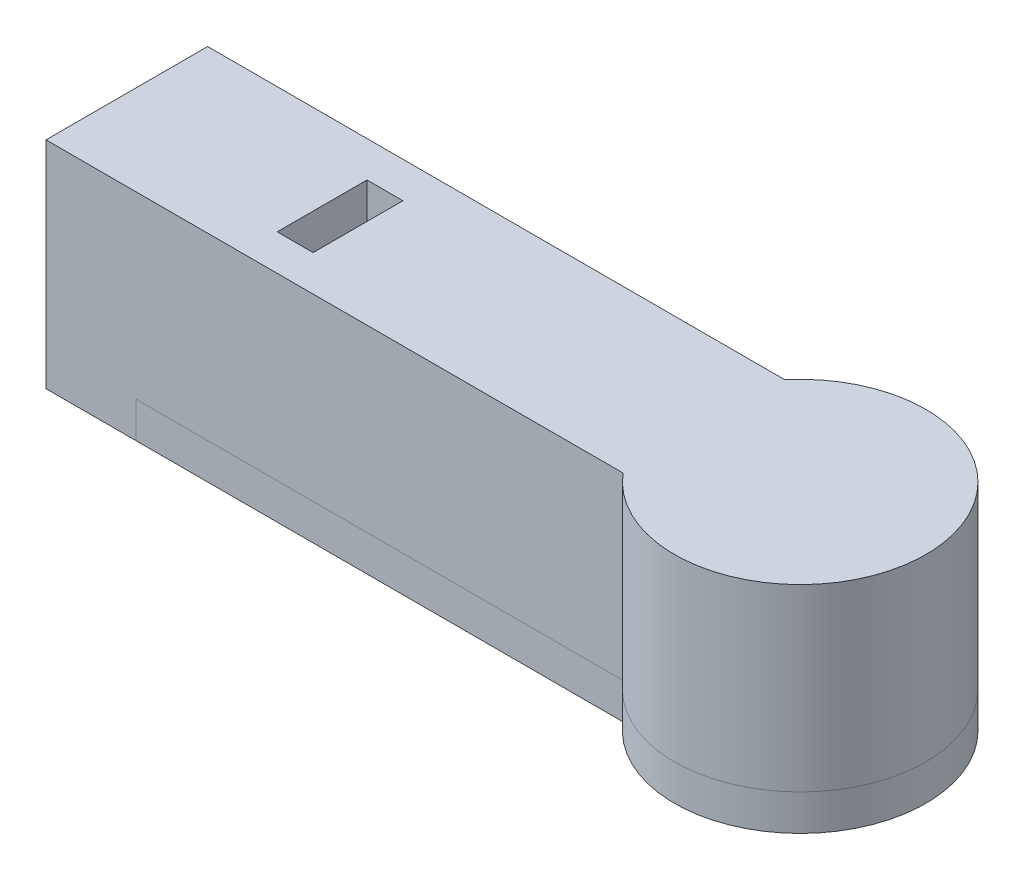
ISO-10303-21;
HEADER;
FILE_DESCRIPTION(('STEP AP214'),'2;1');
FILE_NAME('part.step','',(''),(''),'','','');
FILE_SCHEMA(('AUTOMOTIVE_DESIGN { 1 0 10303 214 1 1 1 1 }'));
ENDSEC;
DATA;
#1=APPLICATION_CONTEXT('core data for automotive mechanical design processes');
#2=APPLICATION_PROTOCOL_DEFINITION('international standard','automotive_design',2000,#1);
#3=PRODUCT_CONTEXT('',#1,'mechanical');
#4=PRODUCT('Part','Part','',(#3));
#5=PRODUCT_RELATED_PRODUCT_CATEGORY('part','',(#4));
#6=PRODUCT_DEFINITION_FORMATION('','',#4);
#7=PRODUCT_DEFINITION_CONTEXT('part definition',#1,'design');
#8=PRODUCT_DEFINITION('design','',#6,#7);
#9=PRODUCT_DEFINITION_SHAPE('','',#8);
#10=(LENGTH_UNIT() NAMED_UNIT(*) SI_UNIT(.MILLI.,.METRE.));
#11=(NAMED_UNIT(*) PLANE_ANGLE_UNIT() SI_UNIT($,.RADIAN.));
#12=(NAMED_UNIT(*) SI_UNIT($,.STERADIAN.) SOLID_ANGLE_UNIT());
#13=UNCERTAINTY_MEASURE_WITH_UNIT(LENGTH_MEASURE(1.E-05),#10,'distance_accuracy_value','');
#14=(GEOMETRIC_REPRESENTATION_CONTEXT(3) GLOBAL_UNCERTAINTY_ASSIGNED_CONTEXT((#13)) GLOBAL_UNIT_ASSIGNED_CONTEXT((#10,
#11,#12)) REPRESENTATION_CONTEXT('',''));
#15=CARTESIAN_POINT('',(0.,0.,0.));
#16=DIRECTION('',(0.,0.,1.));
#17=DIRECTION('',(1.,0.,0.));
#18=AXIS2_PLACEMENT_3D('',#15,#16,#17);
#19=CARTESIAN_POINT('',(32.4914636122196,-12.,1.09900668424429));
#20=DIRECTION('',(0.,-1.,0.));
#21=DIRECTION('',(0.,0.,-1.));
#22=AXIS2_PLACEMENT_3D('',#19,#20,#21);
#23=PLANE('',#22);
#24=DIRECTION('',(0.,0.,-1.));
#25=VECTOR('',#24,1.);
#26=CARTESIAN_POINT('',(0.,-12.,5.59900668424429));
#27=LINE('',#26,#25);
#28=CARTESIAN_POINT('',(0.,-12.,5.59900668424429));
#29=VERTEX_POINT('',#28);
#30=CARTESIAN_POINT('',(0.,-12.,-3.40099331575571));
#31=VERTEX_POINT('',#30);
#32=EDGE_CURVE('E97',#29,#31,#27,.T.);
#33=ORIENTED_EDGE('',*,*,#32,.T.);
#34=DIRECTION('',(1.,0.,0.));
#35=VECTOR('',#34,1.);
#36=CARTESIAN_POINT('',(0.,-12.,-3.40099331575571));
#37=LINE('',#36,#35);
#38=CARTESIAN_POINT('',(27.1295609648378,-12.,-3.40099331575571));
#39=VERTEX_POINT('',#38);
#40=EDGE_CURVE('E92',#31,#39,#37,.T.);
#41=ORIENTED_EDGE('',*,*,#40,.T.);
#42=CARTESIAN_POINT('',(32.4914636122196,-12.,1.09900668424429));
#43=DIRECTION('',(0.,-1.,0.));
#44=DIRECTION('',(0.,0.,-1.));
#45=AXIS2_PLACEMENT_3D('',#42,#43,#44);
#46=CIRCLE('',#45,7.);
#47=CARTESIAN_POINT('',(27.1295609648378,-12.,5.59900668424429));
#48=VERTEX_POINT('',#47);
#49=EDGE_CURVE('E95',#39,#48,#46,.T.);
#50=ORIENTED_EDGE('',*,*,#49,.T.);
#51=DIRECTION('',(-1.,0.,0.));
#52=VECTOR('',#51,1.);
#53=CARTESIAN_POINT('',(0.,-12.,5.59900668424429));
#54=LINE('',#53,#52);
#55=EDGE_CURVE('E62',#48,#29,#54,.T.);
#56=ORIENTED_EDGE('',*,*,#55,.T.);
#57=EDGE_LOOP('',(#33,#41,#50,#56));
#58=FACE_BOUND('',#57,.T.);
#59=CARTESIAN_POINT('',(32.4914636122196,-12.,1.09900668424429));
#60=DIRECTION('',(0.,-1.,0.));
#61=DIRECTION('',(0.,0.,-1.));
#62=AXIS2_PLACEMENT_3D('',#59,#60,#61);
#63=CIRCLE('',#62,3.5);
#64=CARTESIAN_POINT('',(32.4914636122196,-12.,-2.40099331575571));
#65=VERTEX_POINT('',#64);
#66=EDGE_CURVE('E112',#65,#65,#63,.T.);
#67=ORIENTED_EDGE('',*,*,#66,.F.);
#68=EDGE_LOOP('',(#67));
#69=FACE_BOUND('',#68,.T.);
#70=ADVANCED_FACE('F45',(#58,#69),#23,.T.);
#71=CARTESIAN_POINT('',(32.4914636122196,-10.,1.09900668424429));
#72=DIRECTION('',(0.,-1.,0.));
#73=DIRECTION('',(0.,0.,-1.));
#74=AXIS2_PLACEMENT_3D('',#71,#72,#73);
#75=PLANE('',#74);
#76=DIRECTION('',(0.,0.,-1.));
#77=VECTOR('',#76,1.);
#78=CARTESIAN_POINT('',(0.,-10.,5.59900668424429));
#79=LINE('',#78,#77);
#80=CARTESIAN_POINT('',(0.,-10.,5.59900668424429));
#81=VERTEX_POINT('',#80);
#82=CARTESIAN_POINT('',(0.,-10.,-3.40099331575571));
#83=VERTEX_POINT('',#82);
#84=EDGE_CURVE('E109',#81,#83,#79,.T.);
#85=ORIENTED_EDGE('',*,*,#84,.F.);
#86=DIRECTION('',(-1.,0.,0.));
#87=VECTOR('',#86,1.);
#88=CARTESIAN_POINT('',(0.,-10.,5.59900668424429));
#89=LINE('',#88,#87);
#90=CARTESIAN_POINT('',(27.1295609648378,-10.,5.59900668424429));
#91=VERTEX_POINT('',#90);
#92=EDGE_CURVE('E85',#91,#81,#89,.T.);
#93=ORIENTED_EDGE('',*,*,#92,.F.);
#94=CARTESIAN_POINT('',(32.4914636122196,-10.,1.09900668424429));
#95=DIRECTION('',(0.,-1.,0.));
#96=DIRECTION('',(0.,0.,-1.));
#97=AXIS2_PLACEMENT_3D('',#94,#95,#96);
#98=CIRCLE('',#97,7.);
#99=CARTESIAN_POINT('',(27.1295609648378,-10.,-3.40099331575571));
#100=VERTEX_POINT('',#99);
#101=EDGE_CURVE('E79',#100,#91,#98,.T.);
#102=ORIENTED_EDGE('',*,*,#101,.F.);
#103=DIRECTION('',(1.,0.,0.));
#104=VECTOR('',#103,1.);
#105=CARTESIAN_POINT('',(0.,-10.,-3.40099331575571));
#106=LINE('',#105,#104);
#107=EDGE_CURVE('E101',#83,#100,#106,.T.);
#108=ORIENTED_EDGE('',*,*,#107,.F.);
#109=EDGE_LOOP('',(#85,#93,#102,#108));
#110=FACE_BOUND('',#109,.T.);
#111=CARTESIAN_POINT('',(32.4914636122196,-10.,1.09900668424429));
#112=DIRECTION('',(0.,-1.,0.));
#113=DIRECTION('',(0.,0.,-1.));
#114=AXIS2_PLACEMENT_3D('',#111,#112,#113);
#115=CIRCLE('',#114,3.5);
#116=CARTESIAN_POINT('',(32.4914636122196,-10.,-2.40099331575571));
#117=VERTEX_POINT('',#116);
#118=EDGE_CURVE('E124',#117,#117,#115,.T.);
#119=ORIENTED_EDGE('',*,*,#118,.T.);
#120=EDGE_LOOP('',(#119));
#121=FACE_BOUND('',#120,.T.);
#122=ADVANCED_FACE('F120',(#110,#121),#75,.F.);
#123=CARTESIAN_POINT('',(0.,-12.,5.59900668424429));
#124=DIRECTION('',(1.,0.,0.));
#125=DIRECTION('',(0.,0.,-1.));
#126=AXIS2_PLACEMENT_3D('',#123,#124,#125);
#127=PLANE('',#126);
#128=ORIENTED_EDGE('',*,*,#84,.T.);
#129=DIRECTION('',(0.,1.,0.));
#130=VECTOR('',#129,1.);
#131=CARTESIAN_POINT('',(0.,-12.,-3.40099331575571));
#132=LINE('',#131,#130);
#133=EDGE_CURVE('E12',#31,#83,#132,.T.);
#134=ORIENTED_EDGE('',*,*,#133,.F.);
#135=ORIENTED_EDGE('',*,*,#32,.F.);
#136=DIRECTION('',(0.,1.,0.));
#137=VECTOR('',#136,1.);
#138=CARTESIAN_POINT('',(0.,-12.,5.59900668424429));
#139=LINE('',#138,#137);
#140=EDGE_CURVE('E105',#29,#81,#139,.T.);
#141=ORIENTED_EDGE('',*,*,#140,.T.);
#142=EDGE_LOOP('',(#128,#134,#135,#141));
#143=FACE_BOUND('',#142,.T.);
#144=ADVANCED_FACE('F47',(#143),#127,.F.);
#145=CARTESIAN_POINT('',(0.,-12.,-3.40099331575571));
#146=DIRECTION('',(0.,0.,1.));
#147=DIRECTION('',(1.,0.,0.));
#148=AXIS2_PLACEMENT_3D('',#145,#146,#147);
#149=PLANE('',#148);
#150=ORIENTED_EDGE('',*,*,#107,.T.);
#151=DIRECTION('',(0.,1.,0.));
#152=VECTOR('',#151,1.);
#153=CARTESIAN_POINT('',(27.1295609648378,-12.,-3.40099331575571));
#154=LINE('',#153,#152);
#155=EDGE_CURVE('E54',#39,#100,#154,.T.);
#156=ORIENTED_EDGE('',*,*,#155,.F.);
#157=ORIENTED_EDGE('',*,*,#40,.F.);
#158=ORIENTED_EDGE('',*,*,#133,.T.);
#159=EDGE_LOOP('',(#150,#156,#157,#158));
#160=FACE_BOUND('',#159,.T.);
#161=ADVANCED_FACE('F100',(#160),#149,.F.);
#162=CARTESIAN_POINT('',(32.4914636122196,-12.,1.09900668424429));
#163=DIRECTION('',(0.,1.,0.));
#164=DIRECTION('',(0.,0.,1.));
#165=AXIS2_PLACEMENT_3D('',#162,#163,#164);
#166=CYLINDRICAL_SURFACE('',#165,7.);
#167=ORIENTED_EDGE('',*,*,#101,.T.);
#168=DIRECTION('',(0.,1.,0.));
#169=VECTOR('',#168,1.);
#170=CARTESIAN_POINT('',(27.1295609648378,-12.,5.59900668424429));
#171=LINE('',#170,#169);
#172=EDGE_CURVE('E102',#48,#91,#171,.T.);
#173=ORIENTED_EDGE('',*,*,#172,.F.);
#174=ORIENTED_EDGE('',*,*,#49,.F.);
#175=ORIENTED_EDGE('',*,*,#155,.T.);
#176=EDGE_LOOP('',(#167,#173,#174,#175));
#177=FACE_BOUND('',#176,.T.);
#178=ADVANCED_FACE('F103',(#177),#166,.T.);
#179=CARTESIAN_POINT('',(0.,-12.,5.59900668424429));
#180=DIRECTION('',(0.,0.,-1.));
#181=DIRECTION('',(-1.,0.,0.));
#182=AXIS2_PLACEMENT_3D('',#179,#180,#181);
#183=PLANE('',#182);
#184=ORIENTED_EDGE('',*,*,#92,.T.);
#185=ORIENTED_EDGE('',*,*,#140,.F.);
#186=ORIENTED_EDGE('',*,*,#55,.F.);
#187=ORIENTED_EDGE('',*,*,#172,.T.);
#188=EDGE_LOOP('',(#184,#185,#186,#187));
#189=FACE_BOUND('',#188,.T.);
#190=ADVANCED_FACE('F117',(#189),#183,.F.);
#191=CARTESIAN_POINT('',(32.4914636122196,-12.,1.09900668424429));
#192=DIRECTION('',(0.,1.,0.));
#193=DIRECTION('',(0.,0.,1.));
#194=AXIS2_PLACEMENT_3D('',#191,#192,#193);
#195=CYLINDRICAL_SURFACE('',#194,3.5);
#196=ORIENTED_EDGE('',*,*,#66,.T.);
#197=EDGE_LOOP('',(#196));
#198=FACE_BOUND('',#197,.T.);
#199=ORIENTED_EDGE('',*,*,#118,.F.);
#200=EDGE_LOOP('',(#199));
#201=FACE_BOUND('',#200,.T.);
#202=ADVANCED_FACE('F130',(#198,#201),#195,.F.);
#203=CLOSED_SHELL('',(#70,#122,#144,#161,#178,#190,#202));
#204=MANIFOLD_SOLID_BREP('B2',#203);
#205=CARTESIAN_POINT('',(32.4914636122196,-2.,1.09900668424429));
#206=DIRECTION('',(0.,1.,0.));
#207=DIRECTION('',(0.,0.,1.));
#208=AXIS2_PLACEMENT_3D('',#205,#206,#207);
#209=PLANE('',#208);
#210=DIRECTION('',(1.,0.,0.));
#211=VECTOR('',#210,1.);
#212=CARTESIAN_POINT('',(4.,-2.,-1.40099331575571));
#213=LINE('',#212,#211);
#214=CARTESIAN_POINT('',(4.,-2.,-1.40099331575571));
#215=VERTEX_POINT('',#214);
#216=CARTESIAN_POINT('',(5.87171249538747,-2.,-1.40099331575571));
#217=VERTEX_POINT('',#216);
#218=EDGE_CURVE('E406',#215,#217,#213,.T.);
#219=ORIENTED_EDGE('',*,*,#218,.T.);
#220=DIRECTION('',(0.,0.,-1.));
#221=VECTOR('',#220,1.);
#222=CARTESIAN_POINT('',(5.87171249538747,-2.,3.59900668424429));
#223=LINE('',#222,#221);
#224=CARTESIAN_POINT('',(5.87171249538747,-2.,3.59900668424429));
#225=VERTEX_POINT('',#224);
#226=EDGE_CURVE('E213',#225,#217,#223,.T.);
#227=ORIENTED_EDGE('',*,*,#226,.F.);
#228=DIRECTION('',(-1.,0.,0.));
#229=VECTOR('',#228,1.);
#230=CARTESIAN_POINT('',(4.,-2.,3.59900668424429));
#231=LINE('',#230,#229);
#232=CARTESIAN_POINT('',(4.,-2.,3.59900668424429));
#233=VERTEX_POINT('',#232);
#234=EDGE_CURVE('E412',#225,#233,#231,.T.);
#235=ORIENTED_EDGE('',*,*,#234,.T.);
#236=DIRECTION('',(0.,0.,-1.));
#237=VECTOR('',#236,1.);
#238=CARTESIAN_POINT('',(4.,-2.,3.59900668424429));
#239=LINE('',#238,#237);
#240=CARTESIAN_POINT('',(4.,-2.,1.09900668424429));
#241=VERTEX_POINT('',#240);
#242=EDGE_CURVE('E401',#233,#241,#239,.T.);
#243=ORIENTED_EDGE('',*,*,#242,.T.);
#244=EDGE_CURVE('E405',#241,#215,#239,.T.);
#245=ORIENTED_EDGE('',*,*,#244,.T.);
#246=EDGE_LOOP('',(#219,#227,#235,#243,#245));
#247=FACE_BOUND('',#246,.T.);
#248=ADVANCED_FACE('F190',(#247),#209,.F.);
#249=CARTESIAN_POINT('',(4.,-10.,3.59900668424429));
#250=DIRECTION('',(1.,0.,0.));
#251=DIRECTION('',(0.,0.,-1.));
#252=AXIS2_PLACEMENT_3D('',#249,#250,#251);
#253=PLANE('',#252);
#254=CARTESIAN_POINT('',(4.,-5.,1.09900668424429));
#255=DIRECTION('',(1.,0.,0.));
#256=DIRECTION('',(0.,0.,-1.));
#257=AXIS2_PLACEMENT_3D('',#254,#255,#256);
#258=CIRCLE('',#257,3.);
#259=CARTESIAN_POINT('',(4.,-3.3416876048223,-1.40099331575571));
#260=VERTEX_POINT('',#259);
#261=EDGE_CURVE('E380',#260,#241,#258,.T.);
#262=ORIENTED_EDGE('',*,*,#261,.F.);
#263=DIRECTION('',(0.,1.,0.));
#264=VECTOR('',#263,1.);
#265=CARTESIAN_POINT('',(4.,-10.,-1.40099331575571));
#266=LINE('',#265,#264);
#267=EDGE_CURVE('E423',#260,#215,#266,.T.);
#268=ORIENTED_EDGE('',*,*,#267,.T.);
#269=ORIENTED_EDGE('',*,*,#244,.F.);
#270=EDGE_LOOP('',(#262,#268,#269));
#271=FACE_BOUND('',#270,.T.);
#272=ADVANCED_FACE('F477',(#271),#253,.T.);
#273=CARTESIAN_POINT('',(4.,-3.34168760482229,3.59900668424429));
#274=VERTEX_POINT('',#273);
#275=EDGE_CURVE('E377',#241,#274,#258,.T.);
#276=ORIENTED_EDGE('',*,*,#275,.F.);
#277=ORIENTED_EDGE('',*,*,#242,.F.);
#278=DIRECTION('',(0.,1.,0.));
#279=VECTOR('',#278,1.);
#280=CARTESIAN_POINT('',(4.,-10.,3.59900668424429));
#281=LINE('',#280,#279);
#282=EDGE_CURVE('E400',#274,#233,#281,.T.);
#283=ORIENTED_EDGE('',*,*,#282,.F.);
#284=EDGE_LOOP('',(#276,#277,#283));
#285=FACE_BOUND('',#284,.T.);
#286=ADVANCED_FACE('F484',(#285),#253,.T.);
#287=CARTESIAN_POINT('',(0.,-2.,-3.40099331575571));
#288=DIRECTION('',(0.,0.,-1.));
#289=DIRECTION('',(-1.,0.,0.));
#290=AXIS2_PLACEMENT_3D('',#287,#288,#289);
#291=PLANE('',#290);
#292=DIRECTION('',(-1.,0.,0.));
#293=VECTOR('',#292,1.);
#294=CARTESIAN_POINT('',(0.,0.,-3.40099331575571));
#295=LINE('',#294,#293);
#296=CARTESIAN_POINT('',(27.1295609648378,0.,-3.40099331575571));
#297=VERTEX_POINT('',#296);
#298=CARTESIAN_POINT('',(-5.,0.,-3.40099331575571));
#299=VERTEX_POINT('',#298);
#300=EDGE_CURVE('E445',#297,#299,#295,.T.);
#301=ORIENTED_EDGE('',*,*,#300,.F.);
#302=DIRECTION('',(0.,1.,0.));
#303=VECTOR('',#302,1.);
#304=CARTESIAN_POINT('',(27.1295609648378,-2.,-3.40099331575571));
#305=LINE('',#304,#303);
#306=CARTESIAN_POINT('',(27.1295609648378,-10.,-3.40099331575571));
#307=VERTEX_POINT('',#306);
#308=EDGE_CURVE('E43',#307,#297,#305,.T.);
#309=ORIENTED_EDGE('',*,*,#308,.F.);
#310=DIRECTION('',(1.,0.,0.));
#311=VECTOR('',#310,1.);
#312=CARTESIAN_POINT('',(0.,-10.,-3.40099331575571));
#313=LINE('',#312,#311);
#314=CARTESIAN_POINT('',(0.,-10.,-3.40099331575571));
#315=VERTEX_POINT('',#314);
#316=EDGE_CURVE('E430',#315,#307,#313,.T.);
#317=ORIENTED_EDGE('',*,*,#316,.F.);
#318=DIRECTION('',(0.,-1.,0.));
#319=VECTOR('',#318,1.);
#320=CARTESIAN_POINT('',(0.,0.,-3.40099331575571));
#321=LINE('',#320,#319);
#322=CARTESIAN_POINT('',(0.,-12.,-3.40099331575571));
#323=VERTEX_POINT('',#322);
#324=EDGE_CURVE('E343',#315,#323,#321,.T.);
#325=ORIENTED_EDGE('',*,*,#324,.T.);
#326=DIRECTION('',(1.,0.,0.));
#327=VECTOR('',#326,1.);
#328=CARTESIAN_POINT('',(-5.,-12.,-3.40099331575571));
#329=LINE('',#328,#327);
#330=CARTESIAN_POINT('',(-5.,-12.,-3.40099331575571));
#331=VERTEX_POINT('',#330);
#332=EDGE_CURVE('E322',#331,#323,#329,.T.);
#333=ORIENTED_EDGE('',*,*,#332,.F.);
#334=DIRECTION('',(0.,-1.,0.));
#335=VECTOR('',#334,1.);
#336=CARTESIAN_POINT('',(-5.,0.,-3.40099331575571));
#337=LINE('',#336,#335);
#338=EDGE_CURVE('E329',#299,#331,#337,.T.);
#339=ORIENTED_EDGE('',*,*,#338,.F.);
#340=EDGE_LOOP('',(#301,#309,#317,#325,#333,#339));
#341=FACE_BOUND('',#340,.T.);
#342=ADVANCED_FACE('F341',(#341),#291,.T.);
#343=CARTESIAN_POINT('',(32.4914636122196,-2.,1.09900668424429));
#344=DIRECTION('',(0.,1.,0.));
#345=DIRECTION('',(0.,0.,1.));
#346=AXIS2_PLACEMENT_3D('',#343,#344,#345);
#347=CYLINDRICAL_SURFACE('',#346,7.);
#348=CARTESIAN_POINT('',(32.4914636122196,0.,1.09900668424429));
#349=DIRECTION('',(0.,1.,0.));
#350=DIRECTION('',(0.,0.,1.));
#351=AXIS2_PLACEMENT_3D('',#348,#349,#350);
#352=CIRCLE('',#351,7.);
#353=CARTESIAN_POINT('',(27.1295609648378,0.,5.59900668424429));
#354=VERTEX_POINT('',#353);
#355=EDGE_CURVE('E442',#354,#297,#352,.T.);
#356=ORIENTED_EDGE('',*,*,#355,.F.);
#357=DIRECTION('',(0.,1.,0.));
#358=VECTOR('',#357,1.);
#359=CARTESIAN_POINT('',(27.1295609648378,-2.,5.59900668424429));
#360=LINE('',#359,#358);
#361=CARTESIAN_POINT('',(27.1295609648378,-10.,5.59900668424429));
#362=VERTEX_POINT('',#361);
#363=EDGE_CURVE('E194',#362,#354,#360,.T.);
#364=ORIENTED_EDGE('',*,*,#363,.F.);
#365=CARTESIAN_POINT('',(32.4914636122196,-10.,1.09900668424429));
#366=DIRECTION('',(0.,-1.,0.));
#367=DIRECTION('',(0.,0.,-1.));
#368=AXIS2_PLACEMENT_3D('',#365,#366,#367);
#369=CIRCLE('',#368,7.);
#370=EDGE_CURVE('E433',#307,#362,#369,.T.);
#371=ORIENTED_EDGE('',*,*,#370,.F.);
#372=ORIENTED_EDGE('',*,*,#308,.T.);
#373=EDGE_LOOP('',(#356,#364,#371,#372));
#374=FACE_BOUND('',#373,.T.);
#375=ADVANCED_FACE('F453',(#374),#347,.T.);
#376=CARTESIAN_POINT('',(0.,-2.,5.59900668424429));
#377=DIRECTION('',(0.,0.,1.));
#378=DIRECTION('',(1.,0.,0.));
#379=AXIS2_PLACEMENT_3D('',#376,#377,#378);
#380=PLANE('',#379);
#381=DIRECTION('',(1.,0.,0.));
#382=VECTOR('',#381,1.);
#383=CARTESIAN_POINT('',(0.,0.,5.59900668424429));
#384=LINE('',#383,#382);
#385=CARTESIAN_POINT('',(-5.,0.,5.59900668424429));
#386=VERTEX_POINT('',#385);
#387=EDGE_CURVE('E439',#386,#354,#384,.T.);
#388=ORIENTED_EDGE('',*,*,#387,.F.);
#389=DIRECTION('',(0.,1.,0.));
#390=VECTOR('',#389,1.);
#391=CARTESIAN_POINT('',(-5.,0.,5.59900668424429));
#392=LINE('',#391,#390);
#393=CARTESIAN_POINT('',(-5.,-12.,5.59900668424429));
#394=VERTEX_POINT('',#393);
#395=EDGE_CURVE('E328',#394,#386,#392,.T.);
#396=ORIENTED_EDGE('',*,*,#395,.F.);
#397=DIRECTION('',(1.,0.,0.));
#398=VECTOR('',#397,1.);
#399=CARTESIAN_POINT('',(-5.,-12.,5.59900668424429));
#400=LINE('',#399,#398);
#401=CARTESIAN_POINT('',(0.,-12.,5.59900668424429));
#402=VERTEX_POINT('',#401);
#403=EDGE_CURVE('E324',#394,#402,#400,.T.);
#404=ORIENTED_EDGE('',*,*,#403,.T.);
#405=DIRECTION('',(0.,1.,0.));
#406=VECTOR('',#405,1.);
#407=CARTESIAN_POINT('',(0.,0.,5.59900668424429));
#408=LINE('',#407,#406);
#409=CARTESIAN_POINT('',(0.,-10.,5.59900668424429));
#410=VERTEX_POINT('',#409);
#411=EDGE_CURVE('E339',#402,#410,#408,.T.);
#412=ORIENTED_EDGE('',*,*,#411,.T.);
#413=DIRECTION('',(-1.,0.,0.));
#414=VECTOR('',#413,1.);
#415=CARTESIAN_POINT('',(0.,-10.,5.59900668424429));
#416=LINE('',#415,#414);
#417=EDGE_CURVE('E436',#362,#410,#416,.T.);
#418=ORIENTED_EDGE('',*,*,#417,.F.);
#419=ORIENTED_EDGE('',*,*,#363,.T.);
#420=EDGE_LOOP('',(#388,#396,#404,#412,#418,#419));
#421=FACE_BOUND('',#420,.T.);
#422=ADVANCED_FACE('F192',(#421),#380,.T.);
#423=CARTESIAN_POINT('',(32.4914636122196,0.,1.09900668424429));
#424=DIRECTION('',(0.,1.,0.));
#425=DIRECTION('',(0.,0.,1.));
#426=AXIS2_PLACEMENT_3D('',#423,#424,#425);
#427=PLANE('',#426);
#428=DIRECTION('',(0.,0.,1.));
#429=VECTOR('',#428,1.);
#430=CARTESIAN_POINT('',(5.87171249538747,0.,1.09900668424428));
#431=LINE('',#430,#429);
#432=CARTESIAN_POINT('',(5.87171249538747,0.,-1.40099331575571));
#433=VERTEX_POINT('',#432);
#434=CARTESIAN_POINT('',(5.87171249538747,0.,3.59900668424429));
#435=VERTEX_POINT('',#434);
#436=EDGE_CURVE('E366',#433,#435,#431,.T.);
#437=ORIENTED_EDGE('',*,*,#436,.F.);
#438=DIRECTION('',(-1.,0.,0.));
#439=VECTOR('',#438,1.);
#440=CARTESIAN_POINT('',(32.4914636122196,0.,-1.40099331575571));
#441=LINE('',#440,#439);
#442=CARTESIAN_POINT('',(7.87171249538747,0.,-1.40099331575571));
#443=VERTEX_POINT('',#442);
#444=EDGE_CURVE('E356',#443,#433,#441,.T.);
#445=ORIENTED_EDGE('',*,*,#444,.F.);
#446=DIRECTION('',(0.,0.,-1.));
#447=VECTOR('',#446,1.);
#448=CARTESIAN_POINT('',(7.87171249538747,0.,1.09900668424428));
#449=LINE('',#448,#447);
#450=CARTESIAN_POINT('',(7.87171249538747,0.,3.59900668424429));
#451=VERTEX_POINT('',#450);
#452=EDGE_CURVE('E362',#451,#443,#449,.T.);
#453=ORIENTED_EDGE('',*,*,#452,.F.);
#454=DIRECTION('',(1.,0.,0.));
#455=VECTOR('',#454,1.);
#456=CARTESIAN_POINT('',(32.4914636122196,0.,3.59900668424429));
#457=LINE('',#456,#455);
#458=EDGE_CURVE('E364',#435,#451,#457,.T.);
#459=ORIENTED_EDGE('',*,*,#458,.F.);
#460=EDGE_LOOP('',(#437,#445,#453,#459));
#461=FACE_BOUND('',#460,.T.);
#462=ORIENTED_EDGE('',*,*,#300,.T.);
#463=DIRECTION('',(0.,0.,-1.));
#464=VECTOR('',#463,1.);
#465=CARTESIAN_POINT('',(-5.,0.,-3.40099331575571));
#466=LINE('',#465,#464);
#467=EDGE_CURVE('E336',#386,#299,#466,.T.);
#468=ORIENTED_EDGE('',*,*,#467,.F.);
#469=ORIENTED_EDGE('',*,*,#387,.T.);
#470=ORIENTED_EDGE('',*,*,#355,.T.);
#471=EDGE_LOOP('',(#462,#468,#469,#470));
#472=FACE_BOUND('',#471,.T.);
#473=ADVANCED_FACE('F454',(#461,#472),#427,.T.);
#474=CARTESIAN_POINT('',(32.4914636122196,-10.,1.09900668424429));
#475=DIRECTION('',(0.,-1.,0.));
#476=DIRECTION('',(0.,0.,-1.));
#477=AXIS2_PLACEMENT_3D('',#474,#475,#476);
#478=PLANE('',#477);
#479=DIRECTION('',(0.,0.,-1.));
#480=VECTOR('',#479,1.);
#481=CARTESIAN_POINT('',(0.,-10.,5.59900668424429));
#482=LINE('',#481,#480);
#483=EDGE_CURVE('E427',#410,#315,#482,.T.);
#484=ORIENTED_EDGE('',*,*,#483,.T.);
#485=ORIENTED_EDGE('',*,*,#316,.T.);
#486=ORIENTED_EDGE('',*,*,#370,.T.);
#487=ORIENTED_EDGE('',*,*,#417,.T.);
#488=EDGE_LOOP('',(#484,#485,#486,#487));
#489=FACE_BOUND('',#488,.T.);
#490=DIRECTION('',(1.,0.,0.));
#491=VECTOR('',#490,1.);
#492=CARTESIAN_POINT('',(4.,-10.,-1.40099331575571));
#493=LINE('',#492,#491);
#494=CARTESIAN_POINT('',(4.,-10.,-1.40099331575571));
#495=VERTEX_POINT('',#494);
#496=CARTESIAN_POINT('',(28.1613365932975,-10.,-1.40099331575571));
#497=VERTEX_POINT('',#496);
#498=EDGE_CURVE('E392',#495,#497,#493,.T.);
#499=ORIENTED_EDGE('',*,*,#498,.F.);
#500=DIRECTION('',(0.,0.,-1.));
#501=VECTOR('',#500,1.);
#502=CARTESIAN_POINT('',(4.,-10.,3.59900668424429));
#503=LINE('',#502,#501);
#504=CARTESIAN_POINT('',(4.,-10.,3.59900668424429));
#505=VERTEX_POINT('',#504);
#506=EDGE_CURVE('E390',#505,#495,#503,.T.);
#507=ORIENTED_EDGE('',*,*,#506,.F.);
#508=DIRECTION('',(-1.,0.,0.));
#509=VECTOR('',#508,1.);
#510=CARTESIAN_POINT('',(4.,-10.,3.59900668424429));
#511=LINE('',#510,#509);
#512=CARTESIAN_POINT('',(28.1613365932975,-10.,3.59900668424428));
#513=VERTEX_POINT('',#512);
#514=EDGE_CURVE('E398',#513,#505,#511,.T.);
#515=ORIENTED_EDGE('',*,*,#514,.F.);
#516=CARTESIAN_POINT('',(32.4914636122196,-10.,1.09900668424429));
#517=DIRECTION('',(0.,-1.,0.));
#518=DIRECTION('',(0.,0.,-1.));
#519=AXIS2_PLACEMENT_3D('',#516,#517,#518);
#520=CIRCLE('',#519,5.);
#521=EDGE_CURVE('E395',#497,#513,#520,.T.);
#522=ORIENTED_EDGE('',*,*,#521,.F.);
#523=EDGE_LOOP('',(#499,#507,#515,#522));
#524=FACE_BOUND('',#523,.T.);
#525=ADVANCED_FACE('F464',(#489,#524),#478,.T.);
#526=CARTESIAN_POINT('',(4.,-6.65831239517771,3.59900668424429));
#527=VERTEX_POINT('',#526);
#528=CARTESIAN_POINT('',(4.,-6.6583123951777,-1.40099331575571));
#529=VERTEX_POINT('',#528);
#530=EDGE_CURVE('E381',#527,#529,#258,.T.);
#531=ORIENTED_EDGE('',*,*,#530,.F.);
#532=EDGE_CURVE('E415',#505,#527,#281,.T.);
#533=ORIENTED_EDGE('',*,*,#532,.F.);
#534=ORIENTED_EDGE('',*,*,#506,.T.);
#535=EDGE_CURVE('E424',#495,#529,#266,.T.);
#536=ORIENTED_EDGE('',*,*,#535,.T.);
#537=EDGE_LOOP('',(#531,#533,#534,#536));
#538=FACE_BOUND('',#537,.T.);
#539=ADVANCED_FACE('F487',(#538),#253,.T.);
#540=CARTESIAN_POINT('',(4.,-10.,-1.40099331575571));
#541=DIRECTION('',(0.,0.,1.));
#542=DIRECTION('',(1.,0.,0.));
#543=AXIS2_PLACEMENT_3D('',#540,#541,#542);
#544=PLANE('',#543);
#545=DIRECTION('',(-1.,0.,0.));
#546=VECTOR('',#545,1.);
#547=CARTESIAN_POINT('',(5.,-3.3416876048223,-1.40099331575571));
#548=LINE('',#547,#546);
#549=CARTESIAN_POINT('',(5.,-3.3416876048223,-1.40099331575571));
#550=VERTEX_POINT('',#549);
#551=EDGE_CURVE('E388',#550,#260,#548,.T.);
#552=ORIENTED_EDGE('',*,*,#551,.F.);
#553=DIRECTION('',(0.,-1.,0.));
#554=VECTOR('',#553,1.);
#555=CARTESIAN_POINT('',(5.,-10.,-1.40099331575571));
#556=LINE('',#555,#554);
#557=CARTESIAN_POINT('',(5.,-6.6583123951777,-1.40099331575571));
#558=VERTEX_POINT('',#557);
#559=EDGE_CURVE('E374',#550,#558,#556,.T.);
#560=ORIENTED_EDGE('',*,*,#559,.T.);
#561=DIRECTION('',(-1.,0.,0.));
#562=VECTOR('',#561,1.);
#563=CARTESIAN_POINT('',(5.,-6.6583123951777,-1.40099331575571));
#564=LINE('',#563,#562);
#565=EDGE_CURVE('E386',#529,#558,#564,.F.);
#566=ORIENTED_EDGE('',*,*,#565,.F.);
#567=ORIENTED_EDGE('',*,*,#535,.F.);
#568=ORIENTED_EDGE('',*,*,#498,.T.);
#569=DIRECTION('',(0.,1.,0.));
#570=VECTOR('',#569,1.);
#571=CARTESIAN_POINT('',(28.1613365932975,-10.,-1.40099331575571));
#572=LINE('',#571,#570);
#573=CARTESIAN_POINT('',(28.1613365932975,-2.,-1.40099331575571));
#574=VERTEX_POINT('',#573);
#575=EDGE_CURVE('E420',#497,#574,#572,.T.);
#576=ORIENTED_EDGE('',*,*,#575,.T.);
#577=CARTESIAN_POINT('',(7.87171249538747,-2.,-1.40099331575571));
#578=VERTEX_POINT('',#577);
#579=EDGE_CURVE('E404',#578,#574,#213,.T.);
#580=ORIENTED_EDGE('',*,*,#579,.F.);
#581=DIRECTION('',(0.,-1.,0.));
#582=VECTOR('',#581,1.);
#583=CARTESIAN_POINT('',(7.87171249538747,3.,-1.40099331575571));
#584=LINE('',#583,#582);
#585=EDGE_CURVE('E205',#443,#578,#584,.T.);
#586=ORIENTED_EDGE('',*,*,#585,.F.);
#587=ORIENTED_EDGE('',*,*,#444,.T.);
#588=DIRECTION('',(0.,-1.,0.));
#589=VECTOR('',#588,1.);
#590=CARTESIAN_POINT('',(5.87171249538747,3.,-1.40099331575571));
#591=LINE('',#590,#589);
#592=EDGE_CURVE('E353',#433,#217,#591,.T.);
#593=ORIENTED_EDGE('',*,*,#592,.T.);
#594=ORIENTED_EDGE('',*,*,#218,.F.);
#595=ORIENTED_EDGE('',*,*,#267,.F.);
#596=EDGE_LOOP('',(#552,#560,#566,#567,#568,#576,#580,#586,#587,#593,#594,#595));
#597=FACE_BOUND('',#596,.T.);
#598=ADVANCED_FACE('F518',(#597),#544,.T.);
#599=CARTESIAN_POINT('',(32.4914636122196,-10.,1.09900668424429));
#600=DIRECTION('',(0.,1.,0.));
#601=DIRECTION('',(0.,0.,1.));
#602=AXIS2_PLACEMENT_3D('',#599,#600,#601);
#603=CYLINDRICAL_SURFACE('',#602,5.);
#604=CARTESIAN_POINT('',(32.4914636122196,-2.,1.09900668424429));
#605=DIRECTION('',(0.,-1.,0.));
#606=DIRECTION('',(0.,0.,-1.));
#607=AXIS2_PLACEMENT_3D('',#604,#605,#606);
#608=CIRCLE('',#607,5.);
#609=CARTESIAN_POINT('',(28.1613365932975,-2.,3.59900668424428));
#610=VERTEX_POINT('',#609);
#611=EDGE_CURVE('E409',#574,#610,#608,.T.);
#612=ORIENTED_EDGE('',*,*,#611,.F.);
#613=ORIENTED_EDGE('',*,*,#575,.F.);
#614=ORIENTED_EDGE('',*,*,#521,.T.);
#615=DIRECTION('',(0.,1.,0.));
#616=VECTOR('',#615,1.);
#617=CARTESIAN_POINT('',(28.1613365932975,-10.,3.59900668424428));
#618=LINE('',#617,#616);
#619=EDGE_CURVE('E418',#513,#610,#618,.T.);
#620=ORIENTED_EDGE('',*,*,#619,.T.);
#621=EDGE_LOOP('',(#612,#613,#614,#620));
#622=FACE_BOUND('',#621,.T.);
#623=ADVANCED_FACE('F502',(#622),#603,.F.);
#624=CARTESIAN_POINT('',(4.,-10.,3.59900668424429));
#625=DIRECTION('',(0.,0.,-1.));
#626=DIRECTION('',(-1.,0.,0.));
#627=AXIS2_PLACEMENT_3D('',#624,#625,#626);
#628=PLANE('',#627);
#629=DIRECTION('',(-1.,0.,0.));
#630=VECTOR('',#629,1.);
#631=CARTESIAN_POINT('',(5.,-6.65831239517771,3.59900668424429));
#632=LINE('',#631,#630);
#633=CARTESIAN_POINT('',(5.,-6.65831239517771,3.59900668424429));
#634=VERTEX_POINT('',#633);
#635=EDGE_CURVE('E384',#634,#527,#632,.T.);
#636=ORIENTED_EDGE('',*,*,#635,.F.);
#637=DIRECTION('',(0.,1.,0.));
#638=VECTOR('',#637,1.);
#639=CARTESIAN_POINT('',(5.,-10.,3.59900668424429));
#640=LINE('',#639,#638);
#641=CARTESIAN_POINT('',(5.,-3.34168760482229,3.59900668424429));
#642=VERTEX_POINT('',#641);
#643=EDGE_CURVE('E371',#634,#642,#640,.T.);
#644=ORIENTED_EDGE('',*,*,#643,.T.);
#645=DIRECTION('',(-1.,0.,0.));
#646=VECTOR('',#645,1.);
#647=CARTESIAN_POINT('',(5.,-3.34168760482229,3.59900668424429));
#648=LINE('',#647,#646);
#649=EDGE_CURVE('E379',#274,#642,#648,.F.);
#650=ORIENTED_EDGE('',*,*,#649,.F.);
#651=ORIENTED_EDGE('',*,*,#282,.T.);
#652=ORIENTED_EDGE('',*,*,#234,.F.);
#653=DIRECTION('',(0.,-1.,0.));
#654=VECTOR('',#653,1.);
#655=CARTESIAN_POINT('',(5.87171249538747,3.,3.59900668424429));
#656=LINE('',#655,#654);
#657=EDGE_CURVE('E354',#435,#225,#656,.T.);
#658=ORIENTED_EDGE('',*,*,#657,.F.);
#659=ORIENTED_EDGE('',*,*,#458,.T.);
#660=DIRECTION('',(0.,-1.,0.));
#661=VECTOR('',#660,1.);
#662=CARTESIAN_POINT('',(7.87171249538747,3.,3.59900668424429));
#663=LINE('',#662,#661);
#664=CARTESIAN_POINT('',(7.87171249538747,-2.,3.59900668424429));
#665=VERTEX_POINT('',#664);
#666=EDGE_CURVE('E357',#451,#665,#663,.T.);
#667=ORIENTED_EDGE('',*,*,#666,.T.);
#668=EDGE_CURVE('E393',#610,#665,#231,.T.);
#669=ORIENTED_EDGE('',*,*,#668,.F.);
#670=ORIENTED_EDGE('',*,*,#619,.F.);
#671=ORIENTED_EDGE('',*,*,#514,.T.);
#672=ORIENTED_EDGE('',*,*,#532,.T.);
#673=EDGE_LOOP('',(#636,#644,#650,#651,#652,#658,#659,#667,#669,#670,#671,#672));
#674=FACE_BOUND('',#673,.T.);
#675=ADVANCED_FACE('F492',(#674),#628,.T.);
#676=ORIENTED_EDGE('',*,*,#668,.T.);
#677=DIRECTION('',(0.,0.,1.));
#678=VECTOR('',#677,1.);
#679=CARTESIAN_POINT('',(7.87171249538747,-2.,3.59900668424429));
#680=LINE('',#679,#678);
#681=EDGE_CURVE('E346',#578,#665,#680,.T.);
#682=ORIENTED_EDGE('',*,*,#681,.F.);
#683=ORIENTED_EDGE('',*,*,#579,.T.);
#684=ORIENTED_EDGE('',*,*,#611,.T.);
#685=EDGE_LOOP('',(#676,#682,#683,#684));
#686=FACE_BOUND('',#685,.T.);
#687=ADVANCED_FACE('F480',(#686),#209,.F.);
#688=CARTESIAN_POINT('',(5.,-5.,1.09900668424429));
#689=DIRECTION('',(-1.,0.,0.));
#690=DIRECTION('',(0.,0.,1.));
#691=AXIS2_PLACEMENT_3D('',#688,#689,#690);
#692=PLANE('',#691);
#693=CARTESIAN_POINT('',(5.,-5.,1.09900668424429));
#694=DIRECTION('',(-1.,0.,0.));
#695=DIRECTION('',(0.,0.,1.));
#696=AXIS2_PLACEMENT_3D('',#693,#694,#695);
#697=CIRCLE('',#696,3.);
#698=EDGE_CURVE('E370',#550,#558,#697,.T.);
#699=ORIENTED_EDGE('',*,*,#698,.T.);
#700=ORIENTED_EDGE('',*,*,#559,.F.);
#701=EDGE_LOOP('',(#699,#700));
#702=FACE_BOUND('',#701,.T.);
#703=ADVANCED_FACE('F491',(#702),#692,.T.);
#704=CARTESIAN_POINT('',(5.,-5.,1.09900668424429));
#705=DIRECTION('',(-1.,0.,0.));
#706=DIRECTION('',(0.,0.,1.));
#707=AXIS2_PLACEMENT_3D('',#704,#705,#706);
#708=CYLINDRICAL_SURFACE('',#707,3.);
#709=ORIENTED_EDGE('',*,*,#261,.T.);
#710=ORIENTED_EDGE('',*,*,#275,.T.);
#711=ORIENTED_EDGE('',*,*,#649,.T.);
#712=EDGE_CURVE('E368',#634,#642,#697,.T.);
#713=ORIENTED_EDGE('',*,*,#712,.F.);
#714=ORIENTED_EDGE('',*,*,#635,.T.);
#715=ORIENTED_EDGE('',*,*,#530,.T.);
#716=ORIENTED_EDGE('',*,*,#565,.T.);
#717=ORIENTED_EDGE('',*,*,#698,.F.);
#718=ORIENTED_EDGE('',*,*,#551,.T.);
#719=EDGE_LOOP('',(#709,#710,#711,#713,#714,#715,#716,#717,#718));
#720=FACE_BOUND('',#719,.T.);
#721=CARTESIAN_POINT('',(-5.,-5.,1.09900668424429));
#722=DIRECTION('',(-1.,0.,0.));
#723=DIRECTION('',(0.,0.,1.));
#724=AXIS2_PLACEMENT_3D('',#721,#722,#723);
#725=CIRCLE('',#724,3.);
#726=CARTESIAN_POINT('',(-5.,-5.,4.09900668424429));
#727=VERTEX_POINT('',#726);
#728=EDGE_CURVE('E460',#727,#727,#725,.T.);
#729=ORIENTED_EDGE('',*,*,#728,.T.);
#730=EDGE_LOOP('',(#729));
#731=FACE_BOUND('',#730,.T.);
#732=ADVANCED_FACE('F498',(#720,#731),#708,.F.);
#733=ORIENTED_EDGE('',*,*,#712,.T.);
#734=ORIENTED_EDGE('',*,*,#643,.F.);
#735=EDGE_LOOP('',(#733,#734));
#736=FACE_BOUND('',#735,.T.);
#737=ADVANCED_FACE('F501',(#736),#692,.T.);
#738=CARTESIAN_POINT('',(5.87171249538747,3.,3.59900668424429));
#739=DIRECTION('',(-1.,0.,0.));
#740=DIRECTION('',(0.,0.,1.));
#741=AXIS2_PLACEMENT_3D('',#738,#739,#740);
#742=PLANE('',#741);
#743=ORIENTED_EDGE('',*,*,#436,.T.);
#744=ORIENTED_EDGE('',*,*,#657,.T.);
#745=ORIENTED_EDGE('',*,*,#226,.T.);
#746=ORIENTED_EDGE('',*,*,#592,.F.);
#747=EDGE_LOOP('',(#743,#744,#745,#746));
#748=FACE_BOUND('',#747,.T.);
#749=ADVANCED_FACE('F520',(#748),#742,.F.);
#750=CARTESIAN_POINT('',(7.87171249538747,3.,3.59900668424429));
#751=DIRECTION('',(1.,0.,0.));
#752=DIRECTION('',(0.,0.,-1.));
#753=AXIS2_PLACEMENT_3D('',#750,#751,#752);
#754=PLANE('',#753);
#755=ORIENTED_EDGE('',*,*,#452,.T.);
#756=ORIENTED_EDGE('',*,*,#585,.T.);
#757=ORIENTED_EDGE('',*,*,#681,.T.);
#758=ORIENTED_EDGE('',*,*,#666,.F.);
#759=EDGE_LOOP('',(#755,#756,#757,#758));
#760=FACE_BOUND('',#759,.T.);
#761=ADVANCED_FACE('F474',(#760),#754,.F.);
#762=CARTESIAN_POINT('',(-5.,0.,0.));
#763=DIRECTION('',(-1.,0.,0.));
#764=DIRECTION('',(0.,0.,1.));
#765=AXIS2_PLACEMENT_3D('',#762,#763,#764);
#766=PLANE('',#765);
#767=ORIENTED_EDGE('',*,*,#338,.T.);
#768=DIRECTION('',(0.,0.,1.));
#769=VECTOR('',#768,1.);
#770=CARTESIAN_POINT('',(-5.,-12.,-3.40099331575571));
#771=LINE('',#770,#769);
#772=EDGE_CURVE('E318',#331,#394,#771,.T.);
#773=ORIENTED_EDGE('',*,*,#772,.T.);
#774=ORIENTED_EDGE('',*,*,#395,.T.);
#775=ORIENTED_EDGE('',*,*,#467,.T.);
#776=EDGE_LOOP('',(#767,#773,#774,#775));
#777=FACE_BOUND('',#776,.T.);
#778=ORIENTED_EDGE('',*,*,#728,.F.);
#779=EDGE_LOOP('',(#778));
#780=FACE_BOUND('',#779,.T.);
#781=ADVANCED_FACE('F333',(#777,#780),#766,.T.);
#782=CARTESIAN_POINT('',(0.,0.,0.));
#783=DIRECTION('',(-1.,0.,0.));
#784=DIRECTION('',(0.,0.,1.));
#785=AXIS2_PLACEMENT_3D('',#782,#783,#784);
#786=PLANE('',#785);
#787=ORIENTED_EDGE('',*,*,#483,.F.);
#788=ORIENTED_EDGE('',*,*,#411,.F.);
#789=DIRECTION('',(0.,0.,1.));
#790=VECTOR('',#789,1.);
#791=CARTESIAN_POINT('',(0.,-12.,-3.40099331575571));
#792=LINE('',#791,#790);
#793=EDGE_CURVE('E459',#323,#402,#792,.T.);
#794=ORIENTED_EDGE('',*,*,#793,.F.);
#795=ORIENTED_EDGE('',*,*,#324,.F.);
#796=EDGE_LOOP('',(#787,#788,#794,#795));
#797=FACE_BOUND('',#796,.T.);
#798=ADVANCED_FACE('F466',(#797),#786,.F.);
#799=CARTESIAN_POINT('',(-5.,-12.,-3.40099331575571));
#800=DIRECTION('',(0.,1.,0.));
#801=DIRECTION('',(0.,0.,1.));
#802=AXIS2_PLACEMENT_3D('',#799,#800,#801);
#803=PLANE('',#802);
#804=ORIENTED_EDGE('',*,*,#793,.T.);
#805=ORIENTED_EDGE('',*,*,#403,.F.);
#806=ORIENTED_EDGE('',*,*,#772,.F.);
#807=ORIENTED_EDGE('',*,*,#332,.T.);
#808=EDGE_LOOP('',(#804,#805,#806,#807));
#809=FACE_BOUND('',#808,.T.);
#810=ADVANCED_FACE('F320',(#809),#803,.F.);
#811=CLOSED_SHELL('',(#248,#272,#286,#342,#375,#422,#473,#525,#539,#598,#623,#675,#687,#703,
#732,#737,#749,#761,#781,#798,#810));
#812=MANIFOLD_SOLID_BREP('B6',#811);
#813=ADVANCED_BREP_SHAPE_REPRESENTATION('',(#18,#204,#812),#14);
#814=SHAPE_DEFINITION_REPRESENTATION(#9,#813);
ENDSEC;
END-ISO-10303-21;
